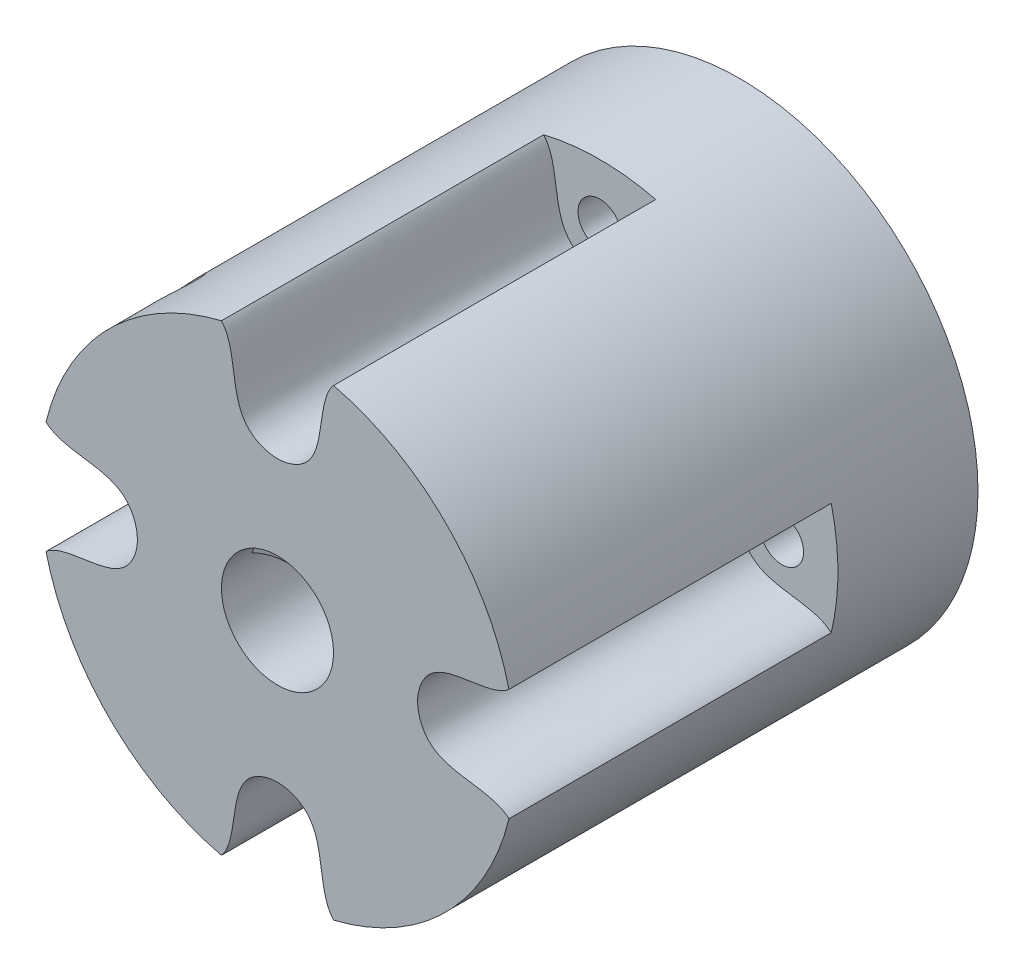
ISO-10303-21;
HEADER;
FILE_DESCRIPTION(('STEP AP214'),'2;1');
FILE_NAME('part.step','',(''),(''),'','','');
FILE_SCHEMA(('AUTOMOTIVE_DESIGN { 1 0 10303 214 1 1 1 1 }'));
ENDSEC;
DATA;
#1=APPLICATION_CONTEXT('core data for automotive mechanical design processes');
#2=APPLICATION_PROTOCOL_DEFINITION('international standard','automotive_design',2000,#1);
#3=PRODUCT_CONTEXT('',#1,'mechanical');
#4=PRODUCT('Part','Part','',(#3));
#5=PRODUCT_RELATED_PRODUCT_CATEGORY('part','',(#4));
#6=PRODUCT_DEFINITION_FORMATION('','',#4);
#7=PRODUCT_DEFINITION_CONTEXT('part definition',#1,'design');
#8=PRODUCT_DEFINITION('design','',#6,#7);
#9=PRODUCT_DEFINITION_SHAPE('','',#8);
#10=(LENGTH_UNIT() NAMED_UNIT(*) SI_UNIT(.MILLI.,.METRE.));
#11=(NAMED_UNIT(*) PLANE_ANGLE_UNIT() SI_UNIT($,.RADIAN.));
#12=(NAMED_UNIT(*) SI_UNIT($,.STERADIAN.) SOLID_ANGLE_UNIT());
#13=UNCERTAINTY_MEASURE_WITH_UNIT(LENGTH_MEASURE(1.E-05),#10,'distance_accuracy_value','');
#14=(GEOMETRIC_REPRESENTATION_CONTEXT(3) GLOBAL_UNCERTAINTY_ASSIGNED_CONTEXT((#13)) GLOBAL_UNIT_ASSIGNED_CONTEXT((#10,
#11,#12)) REPRESENTATION_CONTEXT('',''));
#15=CARTESIAN_POINT('',(0.,0.,0.));
#16=DIRECTION('',(0.,0.,1.));
#17=DIRECTION('',(1.,0.,0.));
#18=AXIS2_PLACEMENT_3D('',#15,#16,#17);
#19=CARTESIAN_POINT('',(0.,0.,9.99999999999999));
#20=DIRECTION('',(0.,0.,1.));
#21=DIRECTION('',(1.,0.,0.));
#22=AXIS2_PLACEMENT_3D('',#19,#20,#21);
#23=CYLINDRICAL_SURFACE('',#22,4.);
#24=CARTESIAN_POINT('',(0.,0.,33.));
#25=DIRECTION('',(0.,0.,1.));
#26=DIRECTION('',(1.,0.,0.));
#27=AXIS2_PLACEMENT_3D('',#24,#25,#26);
#28=CIRCLE('',#27,4.);
#29=CARTESIAN_POINT('',(4.,0.,33.));
#30=VERTEX_POINT('',#29);
#31=EDGE_CURVE('E178',#30,#30,#28,.T.);
#32=ORIENTED_EDGE('',*,*,#31,.T.);
#33=EDGE_LOOP('',(#32));
#34=FACE_BOUND('',#33,.T.);
#35=CARTESIAN_POINT('',(0.,0.,9.99999999999999));
#36=DIRECTION('',(0.,0.,1.));
#37=DIRECTION('',(1.,0.,0.));
#38=AXIS2_PLACEMENT_3D('',#35,#36,#37);
#39=CIRCLE('',#38,4.);
#40=CARTESIAN_POINT('',(4.,0.,9.99999999999999));
#41=VERTEX_POINT('',#40);
#42=EDGE_CURVE('E179',#41,#41,#39,.T.);
#43=ORIENTED_EDGE('',*,*,#42,.F.);
#44=EDGE_LOOP('',(#43));
#45=FACE_BOUND('',#44,.T.);
#46=CARTESIAN_POINT('',(0.,0.,21.9378221735089));
#47=DIRECTION('',(0.612372435695796,0.612372435695794,0.5));
#48=DIRECTION('',(-0.353553390593274,-0.353553390593273,0.866025403784439));
#49=AXIS2_PLACEMENT_3D('',#46,#47,#48);
#50=ELLIPSE('',#49,8.00000000000001,4.);
#51=CARTESIAN_POINT('',(-3.84418012791583,-1.10556734039,28.));
#52=VERTEX_POINT('',#51);
#53=CARTESIAN_POINT('',(-3.78081061074843,1.30593687659552,24.9689110867545));
#54=VERTEX_POINT('',#53);
#55=EDGE_CURVE('E11',#52,#54,#50,.F.);
#56=ORIENTED_EDGE('',*,*,#55,.F.);
#57=CARTESIAN_POINT('',(0.,0.,34.0621778264911));
#58=DIRECTION('',(0.612372435695795,0.612372435695793,-0.5));
#59=DIRECTION('',(0.353553390593275,0.353553390593273,0.866025403784439));
#60=AXIS2_PLACEMENT_3D('',#57,#58,#59);
#61=ELLIPSE('',#60,8.,4.);
#62=CARTESIAN_POINT('',(-3.78081061074843,1.30593687659552,31.0310889132455));
#63=VERTEX_POINT('',#62);
#64=EDGE_CURVE('E49',#63,#52,#61,.F.);
#65=ORIENTED_EDGE('',*,*,#64,.F.);
#66=CARTESIAN_POINT('',(0.,0.,31.0310889132455));
#67=DIRECTION('',(0.,0.,-1.));
#68=DIRECTION('',(-1.,0.,0.));
#69=AXIS2_PLACEMENT_3D('',#66,#67,#68);
#70=CIRCLE('',#69,4.);
#71=CARTESIAN_POINT('',(-1.30593687659552,3.78081061074843,31.0310889132455));
#72=VERTEX_POINT('',#71);
#73=EDGE_CURVE('E312',#72,#63,#70,.F.);
#74=ORIENTED_EDGE('',*,*,#73,.F.);
#75=CARTESIAN_POINT('',(0.,0.,34.0621778264911));
#76=DIRECTION('',(-0.612372435695796,-0.612372435695794,-0.5));
#77=DIRECTION('',(-0.353553390593274,-0.353553390593273,0.866025403784439));
#78=AXIS2_PLACEMENT_3D('',#75,#76,#77);
#79=ELLIPSE('',#78,8.00000000000001,4.);
#80=CARTESIAN_POINT('',(1.10556734038999,3.84418012791583,28.));
#81=VERTEX_POINT('',#80);
#82=EDGE_CURVE('E310',#81,#72,#79,.F.);
#83=ORIENTED_EDGE('',*,*,#82,.F.);
#84=CARTESIAN_POINT('',(0.,0.,21.9378221735089));
#85=DIRECTION('',(-0.612372435695796,-0.612372435695793,0.5));
#86=DIRECTION('',(0.353553390593275,0.353553390593273,0.866025403784439));
#87=AXIS2_PLACEMENT_3D('',#84,#85,#86);
#88=ELLIPSE('',#87,8.,4.);
#89=CARTESIAN_POINT('',(-1.30593687659552,3.78081061074843,24.9689110867545));
#90=VERTEX_POINT('',#89);
#91=EDGE_CURVE('E308',#90,#81,#88,.F.);
#92=ORIENTED_EDGE('',*,*,#91,.F.);
#93=CARTESIAN_POINT('',(0.,0.,24.9689110867545));
#94=DIRECTION('',(0.,0.,1.));
#95=DIRECTION('',(1.,0.,0.));
#96=AXIS2_PLACEMENT_3D('',#93,#94,#95);
#97=CIRCLE('',#96,4.);
#98=EDGE_CURVE('E306',#54,#90,#97,.F.);
#99=ORIENTED_EDGE('',*,*,#98,.F.);
#100=EDGE_LOOP('',(#56,#65,#74,#83,#92,#99));
#101=FACE_BOUND('',#100,.T.);
#102=ADVANCED_FACE('F40',(#34,#45,#101),#23,.F.);
#103=CARTESIAN_POINT('',(0.,0.,10.));
#104=DIRECTION('',(0.,0.,1.));
#105=DIRECTION('',(1.,0.,0.));
#106=AXIS2_PLACEMENT_3D('',#103,#104,#105);
#107=PLANE('',#106);
#108=CARTESIAN_POINT('',(4.,16.5227116418583,10.));
#109=CARTESIAN_POINT('',(2.81623304103462,15.1790975365494,10.));
#110=CARTESIAN_POINT('',(3.69602761665976,11.1900432660125,10.));
#111=CARTESIAN_POINT('',(0.,9.66895732992129,10.));
#112=CARTESIAN_POINT('',(-3.69602761665935,11.1900432660127,10.));
#113=CARTESIAN_POINT('',(-2.81623304103505,15.1790975365492,10.));
#114=CARTESIAN_POINT('',(-4.,16.5227116418583,10.));
#115=B_SPLINE_CURVE_WITH_KNOTS('',3,(#108,#109,#110,#111,#112,#113,#114),.UNSPECIFIED.,.F.,.F.,
(4,1,1,1,4),(0.,0.360911498122282,0.500000000000005,0.639088501877712,1.),.UNSPECIFIED.);
#116=CARTESIAN_POINT('',(4.,16.5227116418583,10.));
#117=VERTEX_POINT('',#116);
#118=CARTESIAN_POINT('',(-4.,16.5227116418583,10.));
#119=VERTEX_POINT('',#118);
#120=EDGE_CURVE('E221',#117,#119,#115,.T.);
#121=ORIENTED_EDGE('',*,*,#120,.F.);
#122=CARTESIAN_POINT('',(0.,0.,10.));
#123=DIRECTION('',(0.,0.,1.));
#124=DIRECTION('',(1.,0.,0.));
#125=AXIS2_PLACEMENT_3D('',#122,#123,#124);
#126=CIRCLE('',#125,17.);
#127=EDGE_CURVE('E303',#117,#119,#126,.T.);
#128=ORIENTED_EDGE('',*,*,#127,.T.);
#129=EDGE_LOOP('',(#121,#128));
#130=FACE_BOUND('',#129,.T.);
#131=CARTESIAN_POINT('',(1.36167772214882E-13,13.,10.));
#132=DIRECTION('',(0.,0.,1.));
#133=DIRECTION('',(1.,0.,0.));
#134=AXIS2_PLACEMENT_3D('',#131,#132,#133);
#135=CIRCLE('',#134,1.55);
#136=CARTESIAN_POINT('',(1.55000000000014,13.,10.));
#137=VERTEX_POINT('',#136);
#138=EDGE_CURVE('E275',#137,#137,#135,.T.);
#139=ORIENTED_EDGE('',*,*,#138,.F.);
#140=EDGE_LOOP('',(#139));
#141=FACE_BOUND('',#140,.T.);
#142=ADVANCED_FACE('F195',(#130,#141),#107,.T.);
#143=CARTESIAN_POINT('',(16.5227116418583,-4.00000000000006,10.));
#144=CARTESIAN_POINT('',(15.1790975365491,-2.8162330410354,10.));
#145=CARTESIAN_POINT('',(11.1900432660126,-3.69602761665968,10.));
#146=CARTESIAN_POINT('',(9.66895732992127,-1.77917576504871E-13,10.));
#147=CARTESIAN_POINT('',(11.1900432660126,3.69602761665935,10.));
#148=CARTESIAN_POINT('',(15.1790975365492,2.81623304103497,10.));
#149=CARTESIAN_POINT('',(16.5227116418583,3.99999999999994,10.));
#150=B_SPLINE_CURVE_WITH_KNOTS('',3,(#143,#144,#145,#146,#147,#148,#149),.UNSPECIFIED.,.F.,.F.,
(4,1,1,1,4),(0.,0.360911498122281,0.499999999999998,0.639088501877713,1.),.UNSPECIFIED.);
#151=CARTESIAN_POINT('',(16.5227116418583,-4.00000000000006,10.));
#152=VERTEX_POINT('',#151);
#153=CARTESIAN_POINT('',(16.5227116418583,3.99999999999994,10.));
#154=VERTEX_POINT('',#153);
#155=EDGE_CURVE('E62',#152,#154,#150,.T.);
#156=ORIENTED_EDGE('',*,*,#155,.F.);
#157=EDGE_CURVE('E300',#152,#154,#126,.T.);
#158=ORIENTED_EDGE('',*,*,#157,.T.);
#159=EDGE_LOOP('',(#156,#158));
#160=FACE_BOUND('',#159,.T.);
#161=CARTESIAN_POINT('',(13.,0.,10.));
#162=DIRECTION('',(0.,0.,1.));
#163=DIRECTION('',(1.,0.,0.));
#164=AXIS2_PLACEMENT_3D('',#161,#162,#163);
#165=CIRCLE('',#164,1.55);
#166=CARTESIAN_POINT('',(14.55,0.,10.));
#167=VERTEX_POINT('',#166);
#168=EDGE_CURVE('E280',#167,#167,#165,.T.);
#169=ORIENTED_EDGE('',*,*,#168,.F.);
#170=EDGE_LOOP('',(#169));
#171=FACE_BOUND('',#170,.T.);
#172=ADVANCED_FACE('F458',(#160,#171),#107,.T.);
#173=CARTESIAN_POINT('',(-4.00000000000012,-16.5227116418583,10.));
#174=CARTESIAN_POINT('',(-2.81623304103545,-15.1790975365491,10.));
#175=CARTESIAN_POINT('',(-3.69602761665971,-11.1900432660126,10.));
#176=CARTESIAN_POINT('',(-2.11019256304925E-13,-9.66895732992127,10.));
#177=CARTESIAN_POINT('',(3.69602761665931,-11.1900432660127,10.));
#178=CARTESIAN_POINT('',(2.81623304103493,-15.1790975365492,10.));
#179=CARTESIAN_POINT('',(3.99999999999988,-16.5227116418583,10.));
#180=B_SPLINE_CURVE_WITH_KNOTS('',3,(#173,#174,#175,#176,#177,#178,#179),.UNSPECIFIED.,.F.,.F.,
(4,1,1,1,4),(0.,0.360911498122281,0.499999999999998,0.639088501877713,1.),.UNSPECIFIED.);
#181=CARTESIAN_POINT('',(-4.00000000000012,-16.5227116418583,10.));
#182=VERTEX_POINT('',#181);
#183=CARTESIAN_POINT('',(3.99999999999989,-16.5227116418583,10.));
#184=VERTEX_POINT('',#183);
#185=EDGE_CURVE('E234',#182,#184,#180,.T.);
#186=ORIENTED_EDGE('',*,*,#185,.F.);
#187=EDGE_CURVE('E302',#182,#184,#126,.T.);
#188=ORIENTED_EDGE('',*,*,#187,.T.);
#189=EDGE_LOOP('',(#186,#188));
#190=FACE_BOUND('',#189,.T.);
#191=CARTESIAN_POINT('',(0.,-13.,10.));
#192=DIRECTION('',(0.,0.,1.));
#193=DIRECTION('',(1.,0.,0.));
#194=AXIS2_PLACEMENT_3D('',#191,#192,#193);
#195=CIRCLE('',#194,1.55);
#196=CARTESIAN_POINT('',(1.54999999999995,-13.,10.));
#197=VERTEX_POINT('',#196);
#198=EDGE_CURVE('E286',#197,#197,#195,.T.);
#199=ORIENTED_EDGE('',*,*,#198,.F.);
#200=EDGE_LOOP('',(#199));
#201=FACE_BOUND('',#200,.T.);
#202=ADVANCED_FACE('F447',(#190,#201),#107,.T.);
#203=CARTESIAN_POINT('',(0.,0.,10.));
#204=DIRECTION('',(0.,0.,-1.));
#205=DIRECTION('',(-1.,0.,0.));
#206=AXIS2_PLACEMENT_3D('',#203,#204,#205);
#207=CYLINDRICAL_SURFACE('',#206,17.);
#208=CARTESIAN_POINT('',(-13.0667611016534,10.8747300799752,28.));
#209=CARTESIAN_POINT('',(-13.0667590882622,10.8747334137986,27.9131301824057));
#210=CARTESIAN_POINT('',(-13.0620576590792,10.8803893083849,27.8262019867989));
#211=CARTESIAN_POINT('',(-13.0433333436767,10.9028280997072,27.6547529901778));
#212=CARTESIAN_POINT('',(-13.0293000250619,10.9196234495147,27.5702349940021));
#213=CARTESIAN_POINT('',(-12.9922051134211,10.9637325621549,27.4061142314592));
#214=CARTESIAN_POINT('',(-12.9691487976742,10.9910401765287,27.3265086234334));
#215=CARTESIAN_POINT('',(-12.9144932024255,11.0552084117274,27.1744230321982));
#216=CARTESIAN_POINT('',(-12.8828956910898,11.092067055269,27.1019415784034));
#217=CARTESIAN_POINT('',(-12.8117295803669,11.1741906485739,26.9659228250608));
#218=CARTESIAN_POINT('',(-12.7721396506212,11.2194780674527,26.9024102495174));
#219=CARTESIAN_POINT('',(-12.6859137841849,11.3168817831607,26.7863447829219));
#220=CARTESIAN_POINT('',(-12.6392775333631,11.3689983844272,26.7337923807326));
#221=CARTESIAN_POINT('',(-12.5399517001079,11.4784613254773,26.6410551539403));
#222=CARTESIAN_POINT('',(-12.4872517438756,11.5358165919617,26.6008919701049));
#223=CARTESIAN_POINT('',(-12.3771592719344,11.6538592323934,26.5342116933296));
#224=CARTESIAN_POINT('',(-12.3197668528147,11.7145465377459,26.5076943195874));
#225=CARTESIAN_POINT('',(-12.2019511500152,11.8372123406797,26.4691302458179));
#226=CARTESIAN_POINT('',(-12.1415368039958,11.89918674651,26.4570432303188));
#227=CARTESIAN_POINT('',(-12.0191880617054,12.0227566102491,26.4475582984812));
#228=CARTESIAN_POINT('',(-11.9572536987294,12.0843520764215,26.4501600606799));
#229=CARTESIAN_POINT('',(-11.8338326822137,12.2052384690106,26.4699459697004));
#230=CARTESIAN_POINT('',(-11.7723452451882,12.2645356991509,26.4870867645521));
#231=CARTESIAN_POINT('',(-11.6514633287782,12.379432972538,26.535396708547));
#232=CARTESIAN_POINT('',(-11.5920688726114,12.4350329747772,26.5665660132571));
#233=CARTESIAN_POINT('',(-11.4771165456914,12.5412094201445,26.6420961604233));
#234=CARTESIAN_POINT('',(-11.4215644392117,12.5917783634768,26.6864763145039));
#235=CARTESIAN_POINT('',(-11.3161551931119,12.6865939323336,26.7871543495165));
#236=CARTESIAN_POINT('',(-11.2662981921557,12.7308404039257,26.8434525205324));
#237=CARTESIAN_POINT('',(-11.1737384224804,12.8121577922177,26.9666125923005));
#238=CARTESIAN_POINT('',(-11.1310623432124,12.8492020161568,27.0335121821624));
#239=CARTESIAN_POINT('',(-11.0545299040505,12.9151046239464,27.1758450150321));
#240=CARTESIAN_POINT('',(-11.020673553683,12.9439629989553,27.2512782672572));
#241=CARTESIAN_POINT('',(-10.9629539056737,12.9928857635794,27.4085647776952));
#242=CARTESIAN_POINT('',(-10.9390922072189,13.0129487459181,27.4904190608147));
#243=CARTESIAN_POINT('',(-10.9022226558596,13.0438539179505,27.6582106902821));
#244=CARTESIAN_POINT('',(-10.8892145290381,13.0546963403482,27.7441479335284));
#245=CARTESIAN_POINT('',(-10.8745507286637,13.0669139047316,27.9173352566723));
#246=CARTESIAN_POINT('',(-10.8728544053145,13.0683229463364,28.004579505265));
#247=CARTESIAN_POINT('',(-10.8807678908433,13.0617347843647,28.1781947917249));
#248=CARTESIAN_POINT('',(-10.8903775731247,13.0537376861114,28.2645658393588));
#249=CARTESIAN_POINT('',(-10.9205281271703,13.0285243428857,28.4338305941013));
#250=CARTESIAN_POINT('',(-10.9410500139507,13.0113241091458,28.5167300716297));
#251=CARTESIAN_POINT('',(-10.9922834065162,12.9680693609882,28.6768775009244));
#252=CARTESIAN_POINT('',(-11.022995107311,12.9420146771165,28.7541253444969));
#253=CARTESIAN_POINT('',(-11.0936421460482,12.8815086412522,28.9010175228077));
#254=CARTESIAN_POINT('',(-11.1336034157729,12.8470336671242,28.9706396544291));
#255=CARTESIAN_POINT('',(-11.2213445152188,12.7704662695941,29.1000793523357));
#256=CARTESIAN_POINT('',(-11.2691245058387,12.72837368943,29.1598967168012));
#257=CARTESIAN_POINT('',(-11.371078530934,12.6373749973659,29.268209648322));
#258=CARTESIAN_POINT('',(-11.4252712173625,12.588448931299,29.3166709031471));
#259=CARTESIAN_POINT('',(-11.5381851226517,12.4850365249152,29.4006602442106));
#260=CARTESIAN_POINT('',(-11.5969062886472,12.4305502495054,29.4361884814004));
#261=CARTESIAN_POINT('',(-11.7169429023742,12.3174685788936,29.4932446964207));
#262=CARTESIAN_POINT('',(-11.7782543114315,12.2588794932962,29.5147936705626));
#263=CARTESIAN_POINT('',(-11.9016914607027,12.1390746879319,29.5433482427981));
#264=CARTESIAN_POINT('',(-11.9638171821257,12.077859028701,29.550354175889));
#265=CARTESIAN_POINT('',(-12.0868423216921,11.9547391980095,29.5496195325925));
#266=CARTESIAN_POINT('',(-12.1477453696532,11.8928383280425,29.5419323361343));
#267=CARTESIAN_POINT('',(-12.2668679327919,11.7699311060791,29.5121412384268));
#268=CARTESIAN_POINT('',(-12.325087444958,11.7089247550866,29.4900373209988));
#269=CARTESIAN_POINT('',(-12.4373081768212,11.5896538081966,29.4320543629902));
#270=CARTESIAN_POINT('',(-12.4913097749899,11.5313889664915,29.3961765600469));
#271=CARTESIAN_POINT('',(-12.5937633454461,11.4194085478829,29.3116701525058));
#272=CARTESIAN_POINT('',(-12.642215380566,11.3656929194748,29.2630416922917));
#273=CARTESIAN_POINT('',(-12.7325968408538,11.2643513765966,29.1542139025706));
#274=CARTESIAN_POINT('',(-12.7745029986683,11.2167472877917,29.0939749249911));
#275=CARTESIAN_POINT('',(-12.8506612119173,11.1294147805782,28.9637112696435));
#276=CARTESIAN_POINT('',(-12.8849114191084,11.0896882641761,28.8936842355316));
#277=CARTESIAN_POINT('',(-12.9450721194354,11.0194037669181,28.7456702848299));
#278=CARTESIAN_POINT('',(-12.9709643577253,10.9888658648753,28.6676664283053));
#279=CARTESIAN_POINT('',(-13.0137384910831,10.9381772075056,28.5060876336391));
#280=CARTESIAN_POINT('',(-13.0306306580102,10.9180146116551,28.4225191695605));
#281=CARTESIAN_POINT('',(-13.0508060856601,10.8938792162948,28.282055341044));
#282=CARTESIAN_POINT('',(-13.0567831460094,10.8867099375818,28.226061045402));
#283=CARTESIAN_POINT('',(-13.0647613045069,10.8771342892689,28.1133861232888));
#284=CARTESIAN_POINT('',(-13.066762415923,10.8747279037749,28.0567054991087));
#285=CARTESIAN_POINT('',(-13.0667611016534,10.8747300799752,28.));
#286=B_SPLINE_CURVE_WITH_KNOTS('',3,(#208,#209,#210,#211,#212,#213,#214,#215,#216,#217,#218,
#219,#220,#221,#222,#223,#224,#225,#226,#227,#228,#229,#230,#231,#232,#233,#234,#235,#236,#237,
#238,#239,#240,#241,#242,#243,#244,#245,#246,#247,#248,#249,#250,#251,#252,#253,#254,#255,#256,
#257,#258,#259,#260,#261,#262,#263,#264,#265,#266,#267,#268,#269,#270,#271,#272,#273,#274,#275,
#276,#277,#278,#279,#280,#281,#282,#283,#284,#285),.UNSPECIFIED.,.T.,.F.,(4,2,2,2,2,2,2,2,2,2,2,
2,2,2,2,2,2,2,2,2,2,2,2,2,2,2,2,2,2,2,2,2,2,2,2,2,2,2,4),(0.,0.260402394498925,
0.521096391038717,0.781638142839428,1.04212599951843,1.30331846800165,1.56452258411344,
1.82618040606755,2.08783284343413,2.34875255383486,2.60966655405044,2.86980529404974,
3.12994691888774,3.39047070205301,3.65100082707756,3.91247884715472,4.17395714965937,
4.43547727384614,4.69699079772046,4.95756404473294,5.21813437405785,5.47825284098682,
5.73837628627282,5.99923803259942,6.26010514778596,6.52175058674327,6.78339297173353,
7.04464146453124,7.30588393943612,7.5661791278156,7.82647460830234,8.08674670569683,
8.34701585599192,8.60819005608319,8.86942723900594,9.13123119538065,9.39273570908537,
9.562717613437,9.73269895054668),.UNSPECIFIED.);
#287=CARTESIAN_POINT('',(-13.0667611016534,10.8747300799752,28.));
#288=VERTEX_POINT('',#287);
#289=EDGE_CURVE('E166',#288,#288,#286,.T.);
#290=ORIENTED_EDGE('',*,*,#289,.T.);
#291=EDGE_LOOP('',(#290));
#292=FACE_BOUND('',#291,.T.);
#293=ORIENTED_EDGE('',*,*,#127,.F.);
#294=DIRECTION('',(0.,0.,-1.));
#295=VECTOR('',#294,1.);
#296=CARTESIAN_POINT('',(4.,16.5227116418583,33.));
#297=LINE('',#296,#295);
#298=CARTESIAN_POINT('',(4.,16.5227116418583,33.));
#299=VERTEX_POINT('',#298);
#300=EDGE_CURVE('E220',#299,#117,#297,.T.);
#301=ORIENTED_EDGE('',*,*,#300,.F.);
#302=CARTESIAN_POINT('',(0.,0.,33.));
#303=DIRECTION('',(0.,0.,1.));
#304=DIRECTION('',(1.,0.,0.));
#305=AXIS2_PLACEMENT_3D('',#302,#303,#304);
#306=CIRCLE('',#305,17.);
#307=CARTESIAN_POINT('',(16.5227116418583,3.99999999999994,33.));
#308=VERTEX_POINT('',#307);
#309=EDGE_CURVE('E214',#308,#299,#306,.T.);
#310=ORIENTED_EDGE('',*,*,#309,.F.);
#311=DIRECTION('',(0.,0.,-1.));
#312=VECTOR('',#311,1.);
#313=CARTESIAN_POINT('',(16.5227116418583,3.99999999999994,33.));
#314=LINE('',#313,#312);
#315=EDGE_CURVE('E254',#308,#154,#314,.T.);
#316=ORIENTED_EDGE('',*,*,#315,.T.);
#317=ORIENTED_EDGE('',*,*,#157,.F.);
#318=DIRECTION('',(0.,0.,-1.));
#319=VECTOR('',#318,1.);
#320=CARTESIAN_POINT('',(16.5227116418583,-4.00000000000006,33.));
#321=LINE('',#320,#319);
#322=CARTESIAN_POINT('',(16.5227116418583,-4.00000000000006,33.));
#323=VERTEX_POINT('',#322);
#324=EDGE_CURVE('E257',#323,#152,#321,.T.);
#325=ORIENTED_EDGE('',*,*,#324,.F.);
#326=CARTESIAN_POINT('',(0.,0.,33.));
#327=DIRECTION('',(0.,0.,1.));
#328=DIRECTION('',(1.,0.,0.));
#329=AXIS2_PLACEMENT_3D('',#326,#327,#328);
#330=CIRCLE('',#329,17.);
#331=CARTESIAN_POINT('',(3.99999999999989,-16.5227116418583,33.));
#332=VERTEX_POINT('',#331);
#333=EDGE_CURVE('E215',#332,#323,#330,.T.);
#334=ORIENTED_EDGE('',*,*,#333,.F.);
#335=DIRECTION('',(0.,0.,-1.));
#336=VECTOR('',#335,1.);
#337=CARTESIAN_POINT('',(3.99999999999989,-16.5227116418583,33.));
#338=LINE('',#337,#336);
#339=EDGE_CURVE('E260',#332,#184,#338,.T.);
#340=ORIENTED_EDGE('',*,*,#339,.T.);
#341=ORIENTED_EDGE('',*,*,#187,.F.);
#342=DIRECTION('',(0.,0.,-1.));
#343=VECTOR('',#342,1.);
#344=CARTESIAN_POINT('',(-4.00000000000012,-16.5227116418583,33.));
#345=LINE('',#344,#343);
#346=CARTESIAN_POINT('',(-4.00000000000012,-16.5227116418583,33.));
#347=VERTEX_POINT('',#346);
#348=EDGE_CURVE('E263',#347,#182,#345,.T.);
#349=ORIENTED_EDGE('',*,*,#348,.F.);
#350=CARTESIAN_POINT('',(0.,0.,33.));
#351=DIRECTION('',(0.,0.,1.));
#352=DIRECTION('',(1.,0.,0.));
#353=AXIS2_PLACEMENT_3D('',#350,#351,#352);
#354=CIRCLE('',#353,17.);
#355=CARTESIAN_POINT('',(-16.5227116418583,-3.99999999999982,33.));
#356=VERTEX_POINT('',#355);
#357=EDGE_CURVE('E576',#356,#347,#354,.T.);
#358=ORIENTED_EDGE('',*,*,#357,.F.);
#359=DIRECTION('',(0.,0.,-1.));
#360=VECTOR('',#359,1.);
#361=CARTESIAN_POINT('',(-16.5227116418583,-3.99999999999982,33.));
#362=LINE('',#361,#360);
#363=CARTESIAN_POINT('',(-16.5227116418583,-3.99999999999982,10.));
#364=VERTEX_POINT('',#363);
#365=EDGE_CURVE('E266',#356,#364,#362,.T.);
#366=ORIENTED_EDGE('',*,*,#365,.T.);
#367=CARTESIAN_POINT('',(-16.5227116418583,4.00000000000017,10.));
#368=VERTEX_POINT('',#367);
#369=EDGE_CURVE('E604',#368,#364,#126,.T.);
#370=ORIENTED_EDGE('',*,*,#369,.F.);
#371=DIRECTION('',(0.,0.,-1.));
#372=VECTOR('',#371,1.);
#373=CARTESIAN_POINT('',(-16.5227116418583,4.00000000000018,33.));
#374=LINE('',#373,#372);
#375=CARTESIAN_POINT('',(-16.5227116418583,4.00000000000018,33.));
#376=VERTEX_POINT('',#375);
#377=EDGE_CURVE('E269',#376,#368,#374,.T.);
#378=ORIENTED_EDGE('',*,*,#377,.F.);
#379=CARTESIAN_POINT('',(0.,0.,33.));
#380=DIRECTION('',(0.,0.,1.));
#381=DIRECTION('',(1.,0.,0.));
#382=AXIS2_PLACEMENT_3D('',#379,#380,#381);
#383=CIRCLE('',#382,17.);
#384=CARTESIAN_POINT('',(-4.,16.5227116418583,33.));
#385=VERTEX_POINT('',#384);
#386=EDGE_CURVE('E567',#385,#376,#383,.T.);
#387=ORIENTED_EDGE('',*,*,#386,.F.);
#388=DIRECTION('',(0.,0.,-1.));
#389=VECTOR('',#388,1.);
#390=CARTESIAN_POINT('',(-4.,16.5227116418583,33.));
#391=LINE('',#390,#389);
#392=EDGE_CURVE('E272',#385,#119,#391,.T.);
#393=ORIENTED_EDGE('',*,*,#392,.T.);
#394=EDGE_LOOP('',(#293,#301,#310,#316,#317,#325,#334,#340,#341,#349,#358,#366,#370,#378,#387,#393));
#395=FACE_BOUND('',#394,.T.);
#396=CARTESIAN_POINT('',(0.,0.,0.));
#397=DIRECTION('',(0.,0.,1.));
#398=DIRECTION('',(1.,0.,0.));
#399=AXIS2_PLACEMENT_3D('',#396,#397,#398);
#400=CIRCLE('',#399,17.);
#401=CARTESIAN_POINT('',(17.,0.,0.));
#402=VERTEX_POINT('',#401);
#403=EDGE_CURVE('E279',#402,#402,#400,.T.);
#404=ORIENTED_EDGE('',*,*,#403,.T.);
#405=EDGE_LOOP('',(#404));
#406=FACE_BOUND('',#405,.T.);
#407=ADVANCED_FACE('F42',(#292,#395,#406),#207,.T.);
#408=CARTESIAN_POINT('',(-16.5227116418583,4.00000000000018,10.));
#409=CARTESIAN_POINT('',(-15.1790975365491,2.81623304103551,10.));
#410=CARTESIAN_POINT('',(-11.1900432660126,3.69602761665975,10.));
#411=CARTESIAN_POINT('',(-9.66895732992127,2.49168766886161E-13,10.));
#412=CARTESIAN_POINT('',(-11.1900432660127,-3.69602761665927,10.));
#413=CARTESIAN_POINT('',(-15.1790975365492,-2.81623304103486,10.));
#414=CARTESIAN_POINT('',(-16.5227116418584,-3.99999999999983,10.));
#415=B_SPLINE_CURVE_WITH_KNOTS('',3,(#408,#409,#410,#411,#412,#413,#414),.UNSPECIFIED.,.F.,.F.,
(4,1,1,1,4),(0.,0.360911498122281,0.499999999999998,0.639088501877713,1.),.UNSPECIFIED.);
#416=EDGE_CURVE('E226',#368,#364,#415,.T.);
#417=ORIENTED_EDGE('',*,*,#416,.F.);
#418=ORIENTED_EDGE('',*,*,#369,.T.);
#419=EDGE_LOOP('',(#417,#418));
#420=FACE_BOUND('',#419,.T.);
#421=CARTESIAN_POINT('',(-13.,0.,10.));
#422=DIRECTION('',(0.,0.,1.));
#423=DIRECTION('',(1.,0.,0.));
#424=AXIS2_PLACEMENT_3D('',#421,#422,#423);
#425=CIRCLE('',#424,1.55);
#426=CARTESIAN_POINT('',(-11.45,0.,10.));
#427=VERTEX_POINT('',#426);
#428=EDGE_CURVE('E292',#427,#427,#425,.T.);
#429=ORIENTED_EDGE('',*,*,#428,.F.);
#430=EDGE_LOOP('',(#429));
#431=FACE_BOUND('',#430,.T.);
#432=ADVANCED_FACE('F439',(#420,#431),#107,.T.);
#433=CARTESIAN_POINT('',(0.,0.,0.));
#434=DIRECTION('',(0.,0.,1.));
#435=DIRECTION('',(1.,0.,0.));
#436=AXIS2_PLACEMENT_3D('',#433,#434,#435);
#437=PLANE('',#436);
#438=CARTESIAN_POINT('',(13.,0.,0.));
#439=DIRECTION('',(0.,0.,1.));
#440=DIRECTION('',(1.,0.,0.));
#441=AXIS2_PLACEMENT_3D('',#438,#439,#440);
#442=CIRCLE('',#441,1.55);
#443=CARTESIAN_POINT('',(14.55,0.,0.));
#444=VERTEX_POINT('',#443);
#445=EDGE_CURVE('E276',#444,#444,#442,.T.);
#446=ORIENTED_EDGE('',*,*,#445,.T.);
#447=EDGE_LOOP('',(#446));
#448=FACE_BOUND('',#447,.T.);
#449=CARTESIAN_POINT('',(0.,-13.,0.));
#450=DIRECTION('',(0.,0.,1.));
#451=DIRECTION('',(1.,0.,0.));
#452=AXIS2_PLACEMENT_3D('',#449,#450,#451);
#453=CIRCLE('',#452,1.55);
#454=CARTESIAN_POINT('',(1.54999999999995,-13.,0.));
#455=VERTEX_POINT('',#454);
#456=EDGE_CURVE('E283',#455,#455,#453,.T.);
#457=ORIENTED_EDGE('',*,*,#456,.T.);
#458=EDGE_LOOP('',(#457));
#459=FACE_BOUND('',#458,.T.);
#460=CARTESIAN_POINT('',(-13.,0.,0.));
#461=DIRECTION('',(0.,0.,1.));
#462=DIRECTION('',(1.,0.,0.));
#463=AXIS2_PLACEMENT_3D('',#460,#461,#462);
#464=CIRCLE('',#463,1.55);
#465=CARTESIAN_POINT('',(-11.45,0.,0.));
#466=VERTEX_POINT('',#465);
#467=EDGE_CURVE('E289',#466,#466,#464,.T.);
#468=ORIENTED_EDGE('',*,*,#467,.T.);
#469=EDGE_LOOP('',(#468));
#470=FACE_BOUND('',#469,.T.);
#471=CARTESIAN_POINT('',(1.36167772214882E-13,13.,0.));
#472=DIRECTION('',(0.,0.,1.));
#473=DIRECTION('',(1.,0.,0.));
#474=AXIS2_PLACEMENT_3D('',#471,#472,#473);
#475=CIRCLE('',#474,1.55);
#476=CARTESIAN_POINT('',(1.55000000000014,13.,0.));
#477=VERTEX_POINT('',#476);
#478=EDGE_CURVE('E295',#477,#477,#475,.T.);
#479=ORIENTED_EDGE('',*,*,#478,.T.);
#480=EDGE_LOOP('',(#479));
#481=FACE_BOUND('',#480,.T.);
#482=ORIENTED_EDGE('',*,*,#403,.F.);
#483=EDGE_LOOP('',(#482));
#484=FACE_BOUND('',#483,.T.);
#485=ADVANCED_FACE('F431',(#448,#459,#470,#481,#484),#437,.F.);
#486=CARTESIAN_POINT('',(1.36167772214882E-13,13.,0.));
#487=DIRECTION('',(0.,0.,1.));
#488=DIRECTION('',(1.,0.,0.));
#489=AXIS2_PLACEMENT_3D('',#486,#487,#488);
#490=CYLINDRICAL_SURFACE('',#489,1.55);
#491=ORIENTED_EDGE('',*,*,#478,.F.);
#492=EDGE_LOOP('',(#491));
#493=FACE_BOUND('',#492,.T.);
#494=ORIENTED_EDGE('',*,*,#138,.T.);
#495=EDGE_LOOP('',(#494));
#496=FACE_BOUND('',#495,.T.);
#497=ADVANCED_FACE('F423',(#493,#496),#490,.F.);
#498=CARTESIAN_POINT('',(-13.,0.,0.));
#499=DIRECTION('',(0.,0.,1.));
#500=DIRECTION('',(1.,0.,0.));
#501=AXIS2_PLACEMENT_3D('',#498,#499,#500);
#502=CYLINDRICAL_SURFACE('',#501,1.55);
#503=ORIENTED_EDGE('',*,*,#467,.F.);
#504=EDGE_LOOP('',(#503));
#505=FACE_BOUND('',#504,.T.);
#506=ORIENTED_EDGE('',*,*,#428,.T.);
#507=EDGE_LOOP('',(#506));
#508=FACE_BOUND('',#507,.T.);
#509=ADVANCED_FACE('F415',(#505,#508),#502,.F.);
#510=CARTESIAN_POINT('',(0.,-13.,0.));
#511=DIRECTION('',(0.,0.,1.));
#512=DIRECTION('',(1.,0.,0.));
#513=AXIS2_PLACEMENT_3D('',#510,#511,#512);
#514=CYLINDRICAL_SURFACE('',#513,1.55);
#515=ORIENTED_EDGE('',*,*,#456,.F.);
#516=EDGE_LOOP('',(#515));
#517=FACE_BOUND('',#516,.T.);
#518=ORIENTED_EDGE('',*,*,#198,.T.);
#519=EDGE_LOOP('',(#518));
#520=FACE_BOUND('',#519,.T.);
#521=ADVANCED_FACE('F406',(#517,#520),#514,.F.);
#522=CARTESIAN_POINT('',(13.,0.,0.));
#523=DIRECTION('',(0.,0.,1.));
#524=DIRECTION('',(1.,0.,0.));
#525=AXIS2_PLACEMENT_3D('',#522,#523,#524);
#526=CYLINDRICAL_SURFACE('',#525,1.55);
#527=ORIENTED_EDGE('',*,*,#445,.F.);
#528=EDGE_LOOP('',(#527));
#529=FACE_BOUND('',#528,.T.);
#530=ORIENTED_EDGE('',*,*,#168,.T.);
#531=EDGE_LOOP('',(#530));
#532=FACE_BOUND('',#531,.T.);
#533=ADVANCED_FACE('F397',(#529,#532),#526,.F.);
#534=CARTESIAN_POINT('',(4.,16.5227116418583,33.));
#535=CARTESIAN_POINT('',(2.81623304103462,15.1790975365494,33.));
#536=CARTESIAN_POINT('',(3.69602761665976,11.1900432660125,33.));
#537=CARTESIAN_POINT('',(0.,9.66895732992129,33.));
#538=CARTESIAN_POINT('',(-3.69602761665935,11.1900432660127,33.));
#539=CARTESIAN_POINT('',(-2.81623304103505,15.1790975365492,33.));
#540=CARTESIAN_POINT('',(-4.,16.5227116418583,33.));
#541=B_SPLINE_CURVE_WITH_KNOTS('',3,(#534,#535,#536,#537,#538,#539,#540),.UNSPECIFIED.,.F.,.F.,
(4,1,1,1,4),(0.,0.360911498122282,0.500000000000005,0.639088501877712,1.),.UNSPECIFIED.);
#542=DIRECTION('',(0.,0.,-1.));
#543=VECTOR('',#542,1.);
#544=SURFACE_OF_LINEAR_EXTRUSION('',#541,#543);
#545=ORIENTED_EDGE('',*,*,#120,.T.);
#546=ORIENTED_EDGE('',*,*,#392,.F.);
#547=EDGE_CURVE('E248',#299,#385,#541,.T.);
#548=ORIENTED_EDGE('',*,*,#547,.F.);
#549=ORIENTED_EDGE('',*,*,#300,.T.);
#550=EDGE_LOOP('',(#545,#546,#548,#549));
#551=FACE_BOUND('',#550,.T.);
#552=ADVANCED_FACE('F390',(#551),#544,.F.);
#553=CARTESIAN_POINT('',(-16.5227116418583,4.00000000000018,33.));
#554=CARTESIAN_POINT('',(-15.1790975365491,2.81623304103551,33.));
#555=CARTESIAN_POINT('',(-11.1900432660126,3.69602761665975,33.));
#556=CARTESIAN_POINT('',(-9.66895732992127,2.49168766886161E-13,33.));
#557=CARTESIAN_POINT('',(-11.1900432660127,-3.69602761665927,33.));
#558=CARTESIAN_POINT('',(-15.1790975365492,-2.81623304103486,33.));
#559=CARTESIAN_POINT('',(-16.5227116418584,-3.99999999999983,33.));
#560=B_SPLINE_CURVE_WITH_KNOTS('',3,(#553,#554,#555,#556,#557,#558,#559),.UNSPECIFIED.,.F.,.F.,
(4,1,1,1,4),(0.,0.360911498122281,0.499999999999998,0.639088501877713,1.),.UNSPECIFIED.);
#561=DIRECTION('',(0.,0.,-1.));
#562=VECTOR('',#561,1.);
#563=SURFACE_OF_LINEAR_EXTRUSION('',#560,#562);
#564=ORIENTED_EDGE('',*,*,#416,.T.);
#565=ORIENTED_EDGE('',*,*,#365,.F.);
#566=EDGE_CURVE('E571',#376,#356,#560,.T.);
#567=ORIENTED_EDGE('',*,*,#566,.F.);
#568=ORIENTED_EDGE('',*,*,#377,.T.);
#569=EDGE_LOOP('',(#564,#565,#567,#568));
#570=FACE_BOUND('',#569,.T.);
#571=ADVANCED_FACE('F383',(#570),#563,.F.);
#572=CARTESIAN_POINT('',(-4.00000000000012,-16.5227116418583,33.));
#573=CARTESIAN_POINT('',(-2.81623304103545,-15.1790975365491,33.));
#574=CARTESIAN_POINT('',(-3.69602761665971,-11.1900432660126,33.));
#575=CARTESIAN_POINT('',(-2.11019256304925E-13,-9.66895732992127,33.));
#576=CARTESIAN_POINT('',(3.69602761665931,-11.1900432660127,33.));
#577=CARTESIAN_POINT('',(2.81623304103493,-15.1790975365492,33.));
#578=CARTESIAN_POINT('',(3.99999999999988,-16.5227116418583,33.));
#579=B_SPLINE_CURVE_WITH_KNOTS('',3,(#572,#573,#574,#575,#576,#577,#578),.UNSPECIFIED.,.F.,.F.,
(4,1,1,1,4),(0.,0.360911498122281,0.499999999999998,0.639088501877713,1.),.UNSPECIFIED.);
#580=DIRECTION('',(0.,0.,-1.));
#581=VECTOR('',#580,1.);
#582=SURFACE_OF_LINEAR_EXTRUSION('',#579,#581);
#583=ORIENTED_EDGE('',*,*,#185,.T.);
#584=ORIENTED_EDGE('',*,*,#339,.F.);
#585=EDGE_CURVE('E580',#347,#332,#579,.T.);
#586=ORIENTED_EDGE('',*,*,#585,.F.);
#587=ORIENTED_EDGE('',*,*,#348,.T.);
#588=EDGE_LOOP('',(#583,#584,#586,#587));
#589=FACE_BOUND('',#588,.T.);
#590=ADVANCED_FACE('F204',(#589),#582,.F.);
#591=CARTESIAN_POINT('',(16.5227116418583,-4.00000000000006,33.));
#592=CARTESIAN_POINT('',(15.1790975365491,-2.8162330410354,33.));
#593=CARTESIAN_POINT('',(11.1900432660126,-3.69602761665968,33.));
#594=CARTESIAN_POINT('',(9.66895732992127,-1.77917576504871E-13,33.));
#595=CARTESIAN_POINT('',(11.1900432660126,3.69602761665935,33.));
#596=CARTESIAN_POINT('',(15.1790975365492,2.81623304103497,33.));
#597=CARTESIAN_POINT('',(16.5227116418583,3.99999999999994,33.));
#598=B_SPLINE_CURVE_WITH_KNOTS('',3,(#591,#592,#593,#594,#595,#596,#597),.UNSPECIFIED.,.F.,.F.,
(4,1,1,1,4),(0.,0.360911498122281,0.499999999999998,0.639088501877713,1.),.UNSPECIFIED.);
#599=DIRECTION('',(0.,0.,-1.));
#600=VECTOR('',#599,1.);
#601=SURFACE_OF_LINEAR_EXTRUSION('',#598,#600);
#602=ORIENTED_EDGE('',*,*,#155,.T.);
#603=ORIENTED_EDGE('',*,*,#315,.F.);
#604=EDGE_CURVE('E208',#323,#308,#598,.T.);
#605=ORIENTED_EDGE('',*,*,#604,.F.);
#606=ORIENTED_EDGE('',*,*,#324,.T.);
#607=EDGE_LOOP('',(#602,#603,#605,#606));
#608=FACE_BOUND('',#607,.T.);
#609=ADVANCED_FACE('F199',(#608),#601,.F.);
#610=CARTESIAN_POINT('',(0.,10.,33.));
#611=DIRECTION('',(0.,0.,-1.));
#612=DIRECTION('',(-1.,0.,0.));
#613=AXIS2_PLACEMENT_3D('',#610,#611,#612);
#614=PLANE('',#613);
#615=ORIENTED_EDGE('',*,*,#31,.F.);
#616=EDGE_LOOP('',(#615));
#617=FACE_BOUND('',#616,.T.);
#618=ORIENTED_EDGE('',*,*,#547,.T.);
#619=ORIENTED_EDGE('',*,*,#386,.T.);
#620=ORIENTED_EDGE('',*,*,#566,.T.);
#621=ORIENTED_EDGE('',*,*,#357,.T.);
#622=ORIENTED_EDGE('',*,*,#585,.T.);
#623=ORIENTED_EDGE('',*,*,#333,.T.);
#624=ORIENTED_EDGE('',*,*,#604,.T.);
#625=ORIENTED_EDGE('',*,*,#309,.T.);
#626=EDGE_LOOP('',(#618,#619,#620,#621,#622,#623,#624,#625));
#627=FACE_BOUND('',#626,.T.);
#628=ADVANCED_FACE('F191',(#617,#627),#614,.F.);
#629=CARTESIAN_POINT('',(0.,0.,9.99999999999999));
#630=DIRECTION('',(0.,0.,1.));
#631=DIRECTION('',(1.,0.,0.));
#632=AXIS2_PLACEMENT_3D('',#629,#630,#631);
#633=PLANE('',#632);
#634=ORIENTED_EDGE('',*,*,#42,.T.);
#635=EDGE_LOOP('',(#634));
#636=FACE_BOUND('',#635,.T.);
#637=ADVANCED_FACE('F186',(#636),#633,.T.);
#638=CARTESIAN_POINT('',(-1.4142135623731,1.4142135623731,28.));
#639=DIRECTION('',(-0.707106781186546,0.707106781186549,0.));
#640=DIRECTION('',(-0.707106781186549,-0.707106781186546,0.));
#641=AXIS2_PLACEMENT_3D('',#638,#639,#640);
#642=CYLINDRICAL_SURFACE('',#641,1.55);
#643=CARTESIAN_POINT('',(-4.94974746830583,4.94974746830584,28.));
#644=DIRECTION('',(-0.707106781186546,0.707106781186549,0.));
#645=DIRECTION('',(-0.707106781186549,-0.707106781186546,0.));
#646=AXIS2_PLACEMENT_3D('',#643,#644,#645);
#647=CIRCLE('',#646,1.55);
#648=CARTESIAN_POINT('',(-6.04576297914498,3.85373195746669,28.));
#649=VERTEX_POINT('',#648);
#650=EDGE_CURVE('E162',#649,#649,#647,.F.);
#651=ORIENTED_EDGE('',*,*,#650,.T.);
#652=EDGE_LOOP('',(#651));
#653=FACE_BOUND('',#652,.T.);
#654=ORIENTED_EDGE('',*,*,#289,.F.);
#655=EDGE_LOOP('',(#654));
#656=FACE_BOUND('',#655,.T.);
#657=ADVANCED_FACE('F181',(#653,#656),#642,.F.);
#658=CARTESIAN_POINT('',(-6.18718433538229,3.71231060122938,24.9689110867545));
#659=DIRECTION('',(0.612372435695796,0.612372435695794,0.5));
#660=DIRECTION('',(-0.707106781186546,0.707106781186549,0.));
#661=AXIS2_PLACEMENT_3D('',#658,#659,#660);
#662=PLANE('',#661);
#663=ORIENTED_EDGE('',*,*,#55,.T.);
#664=DIRECTION('',(0.707106781186546,-0.707106781186549,0.));
#665=VECTOR('',#664,1.);
#666=CARTESIAN_POINT('',(-6.18718433538229,3.71231060122938,24.9689110867545));
#667=LINE('',#666,#665);
#668=CARTESIAN_POINT('',(-6.18718433538229,3.71231060122938,24.9689110867545));
#669=VERTEX_POINT('',#668);
#670=EDGE_CURVE('E56',#669,#54,#667,.T.);
#671=ORIENTED_EDGE('',*,*,#670,.F.);
#672=DIRECTION('',(-0.353553390593274,-0.353553390593273,0.866025403784439));
#673=VECTOR('',#672,1.);
#674=CARTESIAN_POINT('',(-6.18718433538229,3.71231060122938,24.9689110867545));
#675=LINE('',#674,#673);
#676=CARTESIAN_POINT('',(-7.42462120245875,2.47487373415293,28.));
#677=VERTEX_POINT('',#676);
#678=EDGE_CURVE('E146',#669,#677,#675,.T.);
#679=ORIENTED_EDGE('',*,*,#678,.T.);
#680=DIRECTION('',(0.707106781186546,-0.707106781186549,0.));
#681=VECTOR('',#680,1.);
#682=CARTESIAN_POINT('',(-7.42462120245875,2.47487373415293,28.));
#683=LINE('',#682,#681);
#684=EDGE_CURVE('E157',#677,#52,#683,.T.);
#685=ORIENTED_EDGE('',*,*,#684,.T.);
#686=EDGE_LOOP('',(#663,#671,#679,#685));
#687=FACE_BOUND('',#686,.T.);
#688=ADVANCED_FACE('F156',(#687),#662,.T.);
#689=CARTESIAN_POINT('',(-7.42462120245875,2.47487373415293,28.));
#690=DIRECTION('',(0.612372435695795,0.612372435695793,-0.5));
#691=DIRECTION('',(-0.707106781186546,0.707106781186549,0.));
#692=AXIS2_PLACEMENT_3D('',#689,#690,#691);
#693=PLANE('',#692);
#694=ORIENTED_EDGE('',*,*,#64,.T.);
#695=ORIENTED_EDGE('',*,*,#684,.F.);
#696=DIRECTION('',(0.353553390593275,0.353553390593273,0.866025403784438));
#697=VECTOR('',#696,1.);
#698=CARTESIAN_POINT('',(-7.42462120245875,2.47487373415293,28.));
#699=LINE('',#698,#697);
#700=CARTESIAN_POINT('',(-6.18718433538229,3.71231060122938,31.0310889132455));
#701=VERTEX_POINT('',#700);
#702=EDGE_CURVE('E141',#677,#701,#699,.T.);
#703=ORIENTED_EDGE('',*,*,#702,.T.);
#704=DIRECTION('',(0.707106781186546,-0.707106781186549,0.));
#705=VECTOR('',#704,1.);
#706=CARTESIAN_POINT('',(-6.18718433538229,3.71231060122938,31.0310889132455));
#707=LINE('',#706,#705);
#708=EDGE_CURVE('E163',#701,#63,#707,.T.);
#709=ORIENTED_EDGE('',*,*,#708,.T.);
#710=EDGE_LOOP('',(#694,#695,#703,#709));
#711=FACE_BOUND('',#710,.T.);
#712=ADVANCED_FACE('F160',(#711),#693,.T.);
#713=CARTESIAN_POINT('',(-6.18718433538229,3.71231060122938,31.0310889132455));
#714=DIRECTION('',(0.,0.,-1.));
#715=DIRECTION('',(-1.,0.,0.));
#716=AXIS2_PLACEMENT_3D('',#713,#714,#715);
#717=PLANE('',#716);
#718=ORIENTED_EDGE('',*,*,#73,.T.);
#719=ORIENTED_EDGE('',*,*,#708,.F.);
#720=DIRECTION('',(0.707106781186549,0.707106781186546,0.));
#721=VECTOR('',#720,1.);
#722=CARTESIAN_POINT('',(-6.18718433538229,3.71231060122938,31.0310889132455));
#723=LINE('',#722,#721);
#724=CARTESIAN_POINT('',(-3.71231060122937,6.18718433538229,31.0310889132455));
#725=VERTEX_POINT('',#724);
#726=EDGE_CURVE('E148',#701,#725,#723,.T.);
#727=ORIENTED_EDGE('',*,*,#726,.T.);
#728=DIRECTION('',(0.707106781186546,-0.707106781186549,0.));
#729=VECTOR('',#728,1.);
#730=CARTESIAN_POINT('',(-3.71231060122937,6.18718433538229,31.0310889132455));
#731=LINE('',#730,#729);
#732=EDGE_CURVE('E168',#725,#72,#731,.T.);
#733=ORIENTED_EDGE('',*,*,#732,.T.);
#734=EDGE_LOOP('',(#718,#719,#727,#733));
#735=FACE_BOUND('',#734,.T.);
#736=ADVANCED_FACE('F316',(#735),#717,.T.);
#737=CARTESIAN_POINT('',(-3.71231060122937,6.18718433538229,31.0310889132455));
#738=DIRECTION('',(-0.612372435695796,-0.612372435695794,-0.5));
#739=DIRECTION('',(0.707106781186546,-0.707106781186549,0.));
#740=AXIS2_PLACEMENT_3D('',#737,#738,#739);
#741=PLANE('',#740);
#742=ORIENTED_EDGE('',*,*,#82,.T.);
#743=ORIENTED_EDGE('',*,*,#732,.F.);
#744=DIRECTION('',(0.353553390593274,0.353553390593273,-0.866025403784439));
#745=VECTOR('',#744,1.);
#746=CARTESIAN_POINT('',(-3.71231060122937,6.18718433538229,31.0310889132455));
#747=LINE('',#746,#745);
#748=CARTESIAN_POINT('',(-2.47487373415291,7.42462120245875,28.));
#749=VERTEX_POINT('',#748);
#750=EDGE_CURVE('E340',#725,#749,#747,.T.);
#751=ORIENTED_EDGE('',*,*,#750,.T.);
#752=DIRECTION('',(0.707106781186546,-0.707106781186549,0.));
#753=VECTOR('',#752,1.);
#754=CARTESIAN_POINT('',(-2.47487373415291,7.42462120245875,28.));
#755=LINE('',#754,#753);
#756=EDGE_CURVE('E332',#749,#81,#755,.T.);
#757=ORIENTED_EDGE('',*,*,#756,.T.);
#758=EDGE_LOOP('',(#742,#743,#751,#757));
#759=FACE_BOUND('',#758,.T.);
#760=ADVANCED_FACE('F343',(#759),#741,.T.);
#761=CARTESIAN_POINT('',(-2.47487373415291,7.42462120245875,28.));
#762=DIRECTION('',(-0.612372435695796,-0.612372435695793,0.5));
#763=DIRECTION('',(0.707106781186546,-0.707106781186549,0.));
#764=AXIS2_PLACEMENT_3D('',#761,#762,#763);
#765=PLANE('',#764);
#766=ORIENTED_EDGE('',*,*,#91,.T.);
#767=ORIENTED_EDGE('',*,*,#756,.F.);
#768=DIRECTION('',(-0.353553390593275,-0.353553390593273,-0.866025403784439));
#769=VECTOR('',#768,1.);
#770=CARTESIAN_POINT('',(-2.47487373415291,7.42462120245875,28.));
#771=LINE('',#770,#769);
#772=CARTESIAN_POINT('',(-3.71231060122937,6.18718433538229,24.9689110867545));
#773=VERTEX_POINT('',#772);
#774=EDGE_CURVE('E331',#749,#773,#771,.T.);
#775=ORIENTED_EDGE('',*,*,#774,.T.);
#776=DIRECTION('',(0.707106781186546,-0.707106781186549,0.));
#777=VECTOR('',#776,1.);
#778=CARTESIAN_POINT('',(-3.71231060122937,6.18718433538229,24.9689110867545));
#779=LINE('',#778,#777);
#780=EDGE_CURVE('E325',#773,#90,#779,.T.);
#781=ORIENTED_EDGE('',*,*,#780,.T.);
#782=EDGE_LOOP('',(#766,#767,#775,#781));
#783=FACE_BOUND('',#782,.T.);
#784=ADVANCED_FACE('F327',(#783),#765,.T.);
#785=CARTESIAN_POINT('',(-3.71231060122937,6.18718433538229,24.9689110867545));
#786=DIRECTION('',(0.,0.,1.));
#787=DIRECTION('',(1.,0.,0.));
#788=AXIS2_PLACEMENT_3D('',#785,#786,#787);
#789=PLANE('',#788);
#790=ORIENTED_EDGE('',*,*,#98,.T.);
#791=ORIENTED_EDGE('',*,*,#780,.F.);
#792=DIRECTION('',(-0.707106781186549,-0.707106781186546,0.));
#793=VECTOR('',#792,1.);
#794=CARTESIAN_POINT('',(-3.71231060122937,6.18718433538229,24.9689110867545));
#795=LINE('',#794,#793);
#796=EDGE_CURVE('E335',#773,#669,#795,.T.);
#797=ORIENTED_EDGE('',*,*,#796,.T.);
#798=ORIENTED_EDGE('',*,*,#670,.T.);
#799=EDGE_LOOP('',(#790,#791,#797,#798));
#800=FACE_BOUND('',#799,.T.);
#801=ADVANCED_FACE('F324',(#800),#789,.T.);
#802=CARTESIAN_POINT('',(-4.94974746830582,4.94974746830584,0.));
#803=DIRECTION('',(-0.707106781186546,0.707106781186549,0.));
#804=DIRECTION('',(-0.707106781186549,-0.707106781186546,0.));
#805=AXIS2_PLACEMENT_3D('',#802,#803,#804);
#806=PLANE('',#805);
#807=ORIENTED_EDGE('',*,*,#678,.F.);
#808=ORIENTED_EDGE('',*,*,#796,.F.);
#809=ORIENTED_EDGE('',*,*,#774,.F.);
#810=ORIENTED_EDGE('',*,*,#750,.F.);
#811=ORIENTED_EDGE('',*,*,#726,.F.);
#812=ORIENTED_EDGE('',*,*,#702,.F.);
#813=EDGE_LOOP('',(#807,#808,#809,#810,#811,#812));
#814=FACE_BOUND('',#813,.T.);
#815=ORIENTED_EDGE('',*,*,#650,.F.);
#816=EDGE_LOOP('',(#815));
#817=FACE_BOUND('',#816,.T.);
#818=ADVANCED_FACE('F143',(#814,#817),#806,.F.);
#819=CLOSED_SHELL('',(#102,#142,#172,#202,#407,#432,#485,#497,#509,#521,#533,#552,#571,#590,
#609,#628,#637,#657,#688,#712,#736,#760,#784,#801,#818));
#820=MANIFOLD_SOLID_BREP('B2',#819);
#821=ADVANCED_BREP_SHAPE_REPRESENTATION('',(#18,#820),#14);
#822=SHAPE_DEFINITION_REPRESENTATION(#9,#821);
ENDSEC;
END-ISO-10303-21;
